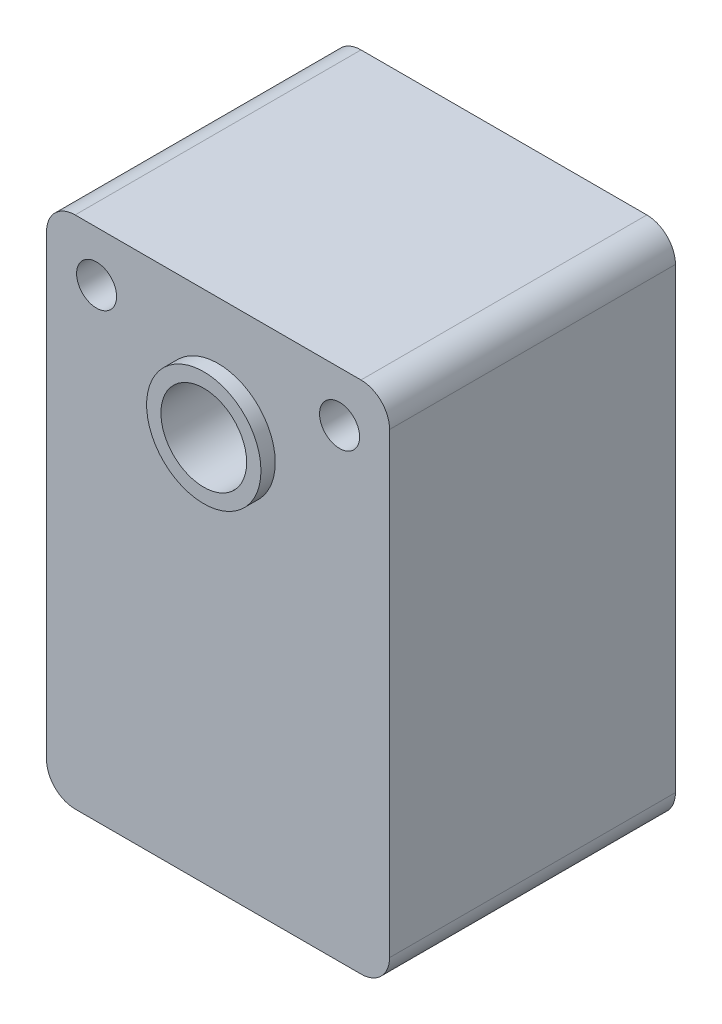
ISO-10303-21;
HEADER;
FILE_DESCRIPTION(('STEP AP214'),'2;1');
FILE_NAME('part.step','',(''),(''),'','','');
FILE_SCHEMA(('AUTOMOTIVE_DESIGN { 1 0 10303 214 1 1 1 1 }'));
ENDSEC;
DATA;
#1=APPLICATION_CONTEXT('core data for automotive mechanical design processes');
#2=APPLICATION_PROTOCOL_DEFINITION('international standard','automotive_design',2000,#1);
#3=PRODUCT_CONTEXT('',#1,'mechanical');
#4=PRODUCT('Part','Part','',(#3));
#5=PRODUCT_RELATED_PRODUCT_CATEGORY('part','',(#4));
#6=PRODUCT_DEFINITION_FORMATION('','',#4);
#7=PRODUCT_DEFINITION_CONTEXT('part definition',#1,'design');
#8=PRODUCT_DEFINITION('design','',#6,#7);
#9=PRODUCT_DEFINITION_SHAPE('','',#8);
#10=(LENGTH_UNIT() NAMED_UNIT(*) SI_UNIT(.MILLI.,.METRE.));
#11=(NAMED_UNIT(*) PLANE_ANGLE_UNIT() SI_UNIT($,.RADIAN.));
#12=(NAMED_UNIT(*) SI_UNIT($,.STERADIAN.) SOLID_ANGLE_UNIT());
#13=UNCERTAINTY_MEASURE_WITH_UNIT(LENGTH_MEASURE(1.E-05),#10,'distance_accuracy_value','');
#14=(GEOMETRIC_REPRESENTATION_CONTEXT(3) GLOBAL_UNCERTAINTY_ASSIGNED_CONTEXT((#13)) GLOBAL_UNIT_ASSIGNED_CONTEXT((#10,
#11,#12)) REPRESENTATION_CONTEXT('',''));
#15=CARTESIAN_POINT('',(0.,0.,0.));
#16=DIRECTION('',(0.,0.,1.));
#17=DIRECTION('',(1.,0.,0.));
#18=AXIS2_PLACEMENT_3D('',#15,#16,#17);
#19=CARTESIAN_POINT('',(0.,0.,10.));
#20=DIRECTION('',(0.,0.,1.));
#21=DIRECTION('',(1.,0.,0.));
#22=AXIS2_PLACEMENT_3D('',#19,#20,#21);
#23=PLANE('',#22);
#24=CARTESIAN_POINT('',(4.25,7.25,10.));
#25=DIRECTION('',(0.,0.,1.));
#26=DIRECTION('',(-1.,0.,0.));
#27=AXIS2_PLACEMENT_3D('',#24,#25,#26);
#28=CIRCLE('',#27,0.7);
#29=CARTESIAN_POINT('',(3.55,7.25,10.));
#30=VERTEX_POINT('',#29);
#31=EDGE_CURVE('E203',#30,#30,#28,.T.);
#32=ORIENTED_EDGE('',*,*,#31,.F.);
#33=EDGE_LOOP('',(#32));
#34=FACE_BOUND('',#33,.T.);
#35=DIRECTION('',(0.,-1.,0.));
#36=VECTOR('',#35,1.);
#37=CARTESIAN_POINT('',(-6.,-9.,10.));
#38=LINE('',#37,#36);
#39=CARTESIAN_POINT('',(-6.,8.,10.));
#40=VERTEX_POINT('',#39);
#41=CARTESIAN_POINT('',(-6.,-8.,10.));
#42=VERTEX_POINT('',#41);
#43=EDGE_CURVE('E150',#40,#42,#38,.T.);
#44=ORIENTED_EDGE('',*,*,#43,.T.);
#45=CARTESIAN_POINT('',(-5.,-8.,10.));
#46=DIRECTION('',(0.,0.,1.));
#47=DIRECTION('',(1.,0.,0.));
#48=AXIS2_PLACEMENT_3D('',#45,#46,#47);
#49=CIRCLE('',#48,1.);
#50=CARTESIAN_POINT('',(-5.,-9.,10.));
#51=VERTEX_POINT('',#50);
#52=EDGE_CURVE('E174',#42,#51,#49,.T.);
#53=ORIENTED_EDGE('',*,*,#52,.T.);
#54=DIRECTION('',(1.,0.,0.));
#55=VECTOR('',#54,1.);
#56=CARTESIAN_POINT('',(6.,-9.,10.));
#57=LINE('',#56,#55);
#58=CARTESIAN_POINT('',(5.,-9.,10.));
#59=VERTEX_POINT('',#58);
#60=EDGE_CURVE('E127',#51,#59,#57,.T.);
#61=ORIENTED_EDGE('',*,*,#60,.T.);
#62=CARTESIAN_POINT('',(5.,-8.,10.));
#63=DIRECTION('',(0.,0.,1.));
#64=DIRECTION('',(1.,0.,0.));
#65=AXIS2_PLACEMENT_3D('',#62,#63,#64);
#66=CIRCLE('',#65,1.);
#67=CARTESIAN_POINT('',(6.,-8.,10.));
#68=VERTEX_POINT('',#67);
#69=EDGE_CURVE('E171',#59,#68,#66,.T.);
#70=ORIENTED_EDGE('',*,*,#69,.T.);
#71=DIRECTION('',(0.,1.,0.));
#72=VECTOR('',#71,1.);
#73=CARTESIAN_POINT('',(6.,-9.,10.));
#74=LINE('',#73,#72);
#75=CARTESIAN_POINT('',(6.,8.,10.));
#76=VERTEX_POINT('',#75);
#77=EDGE_CURVE('E186',#68,#76,#74,.T.);
#78=ORIENTED_EDGE('',*,*,#77,.T.);
#79=CARTESIAN_POINT('',(5.,8.,10.));
#80=DIRECTION('',(0.,0.,1.));
#81=DIRECTION('',(1.,0.,0.));
#82=AXIS2_PLACEMENT_3D('',#79,#80,#81);
#83=CIRCLE('',#82,1.);
#84=CARTESIAN_POINT('',(5.,9.00000000000001,10.));
#85=VERTEX_POINT('',#84);
#86=EDGE_CURVE('E61',#76,#85,#83,.T.);
#87=ORIENTED_EDGE('',*,*,#86,.T.);
#88=DIRECTION('',(-1.,0.,0.));
#89=VECTOR('',#88,1.);
#90=CARTESIAN_POINT('',(6.,9.00000000000001,10.));
#91=LINE('',#90,#89);
#92=CARTESIAN_POINT('',(-5.,9.00000000000001,10.));
#93=VERTEX_POINT('',#92);
#94=EDGE_CURVE('E152',#85,#93,#91,.T.);
#95=ORIENTED_EDGE('',*,*,#94,.T.);
#96=CARTESIAN_POINT('',(-5.,8.,10.));
#97=DIRECTION('',(0.,0.,1.));
#98=DIRECTION('',(1.,0.,0.));
#99=AXIS2_PLACEMENT_3D('',#96,#97,#98);
#100=CIRCLE('',#99,1.);
#101=EDGE_CURVE('E166',#93,#40,#100,.T.);
#102=ORIENTED_EDGE('',*,*,#101,.T.);
#103=EDGE_LOOP('',(#44,#53,#61,#70,#78,#87,#95,#102));
#104=FACE_BOUND('',#103,.T.);
#105=CARTESIAN_POINT('',(-4.25,7.25,10.));
#106=DIRECTION('',(0.,0.,1.));
#107=DIRECTION('',(1.,0.,0.));
#108=AXIS2_PLACEMENT_3D('',#105,#106,#107);
#109=CIRCLE('',#108,0.7);
#110=CARTESIAN_POINT('',(-3.55,7.25,10.));
#111=VERTEX_POINT('',#110);
#112=EDGE_CURVE('E198',#111,#111,#109,.T.);
#113=ORIENTED_EDGE('',*,*,#112,.F.);
#114=EDGE_LOOP('',(#113));
#115=FACE_BOUND('',#114,.T.);
#116=CARTESIAN_POINT('',(0.,4.99999999999999,10.));
#117=DIRECTION('',(0.,0.,1.));
#118=DIRECTION('',(1.,0.,0.));
#119=AXIS2_PLACEMENT_3D('',#116,#117,#118);
#120=CIRCLE('',#119,2.);
#121=CARTESIAN_POINT('',(2.,4.99999999999999,10.));
#122=VERTEX_POINT('',#121);
#123=EDGE_CURVE('E215',#122,#122,#120,.T.);
#124=ORIENTED_EDGE('',*,*,#123,.F.);
#125=EDGE_LOOP('',(#124));
#126=FACE_BOUND('',#125,.T.);
#127=ADVANCED_FACE('F39',(#34,#104,#115,#126),#23,.T.);
#128=CARTESIAN_POINT('',(0.,0.,0.));
#129=DIRECTION('',(0.,0.,1.));
#130=DIRECTION('',(1.,0.,0.));
#131=AXIS2_PLACEMENT_3D('',#128,#129,#130);
#132=PLANE('',#131);
#133=DIRECTION('',(1.,0.,0.));
#134=VECTOR('',#133,1.);
#135=CARTESIAN_POINT('',(6.,-9.,0.));
#136=LINE('',#135,#134);
#137=CARTESIAN_POINT('',(-5.,-9.,0.));
#138=VERTEX_POINT('',#137);
#139=CARTESIAN_POINT('',(5.,-9.,0.));
#140=VERTEX_POINT('',#139);
#141=EDGE_CURVE('E124',#138,#140,#136,.T.);
#142=ORIENTED_EDGE('',*,*,#141,.F.);
#143=CARTESIAN_POINT('',(-5.,-8.,0.));
#144=DIRECTION('',(0.,0.,1.));
#145=DIRECTION('',(1.,0.,0.));
#146=AXIS2_PLACEMENT_3D('',#143,#144,#145);
#147=CIRCLE('',#146,1.);
#148=CARTESIAN_POINT('',(-6.,-8.,0.));
#149=VERTEX_POINT('',#148);
#150=EDGE_CURVE('E106',#138,#149,#147,.F.);
#151=ORIENTED_EDGE('',*,*,#150,.T.);
#152=DIRECTION('',(0.,-1.,0.));
#153=VECTOR('',#152,1.);
#154=CARTESIAN_POINT('',(-6.,-9.,0.));
#155=LINE('',#154,#153);
#156=CARTESIAN_POINT('',(-6.,8.,0.));
#157=VERTEX_POINT('',#156);
#158=EDGE_CURVE('E137',#157,#149,#155,.T.);
#159=ORIENTED_EDGE('',*,*,#158,.F.);
#160=CARTESIAN_POINT('',(-5.,8.,0.));
#161=DIRECTION('',(0.,0.,1.));
#162=DIRECTION('',(1.,0.,0.));
#163=AXIS2_PLACEMENT_3D('',#160,#161,#162);
#164=CIRCLE('',#163,1.);
#165=CARTESIAN_POINT('',(-5.,9.00000000000001,0.));
#166=VERTEX_POINT('',#165);
#167=EDGE_CURVE('E129',#157,#166,#164,.F.);
#168=ORIENTED_EDGE('',*,*,#167,.T.);
#169=DIRECTION('',(-1.,0.,0.));
#170=VECTOR('',#169,1.);
#171=CARTESIAN_POINT('',(6.,9.00000000000001,0.));
#172=LINE('',#171,#170);
#173=CARTESIAN_POINT('',(5.,9.00000000000001,0.));
#174=VERTEX_POINT('',#173);
#175=EDGE_CURVE('E142',#174,#166,#172,.T.);
#176=ORIENTED_EDGE('',*,*,#175,.F.);
#177=CARTESIAN_POINT('',(5.,8.,0.));
#178=DIRECTION('',(0.,0.,1.));
#179=DIRECTION('',(1.,0.,0.));
#180=AXIS2_PLACEMENT_3D('',#177,#178,#179);
#181=CIRCLE('',#180,1.);
#182=CARTESIAN_POINT('',(6.,8.,0.));
#183=VERTEX_POINT('',#182);
#184=EDGE_CURVE('E156',#174,#183,#181,.F.);
#185=ORIENTED_EDGE('',*,*,#184,.T.);
#186=DIRECTION('',(0.,1.,0.));
#187=VECTOR('',#186,1.);
#188=CARTESIAN_POINT('',(6.,-9.,0.));
#189=LINE('',#188,#187);
#190=CARTESIAN_POINT('',(6.,-8.,0.));
#191=VERTEX_POINT('',#190);
#192=EDGE_CURVE('E136',#191,#183,#189,.T.);
#193=ORIENTED_EDGE('',*,*,#192,.F.);
#194=CARTESIAN_POINT('',(5.,-8.,0.));
#195=DIRECTION('',(0.,0.,1.));
#196=DIRECTION('',(1.,0.,0.));
#197=AXIS2_PLACEMENT_3D('',#194,#195,#196);
#198=CIRCLE('',#197,1.);
#199=EDGE_CURVE('E118',#191,#140,#198,.F.);
#200=ORIENTED_EDGE('',*,*,#199,.T.);
#201=EDGE_LOOP('',(#142,#151,#159,#168,#176,#185,#193,#200));
#202=FACE_BOUND('',#201,.T.);
#203=CARTESIAN_POINT('',(0.,4.99999999999999,0.));
#204=DIRECTION('',(0.,0.,1.));
#205=DIRECTION('',(1.,0.,0.));
#206=AXIS2_PLACEMENT_3D('',#203,#204,#205);
#207=CIRCLE('',#206,1.5);
#208=CARTESIAN_POINT('',(1.5,4.99999999999999,0.));
#209=VERTEX_POINT('',#208);
#210=EDGE_CURVE('E144',#209,#209,#207,.T.);
#211=ORIENTED_EDGE('',*,*,#210,.T.);
#212=EDGE_LOOP('',(#211));
#213=FACE_BOUND('',#212,.T.);
#214=CARTESIAN_POINT('',(-4.25,7.25,0.));
#215=DIRECTION('',(0.,0.,1.));
#216=DIRECTION('',(1.,0.,0.));
#217=AXIS2_PLACEMENT_3D('',#214,#215,#216);
#218=CIRCLE('',#217,0.7);
#219=CARTESIAN_POINT('',(-3.55,7.25,0.));
#220=VERTEX_POINT('',#219);
#221=EDGE_CURVE('E199',#220,#220,#218,.T.);
#222=ORIENTED_EDGE('',*,*,#221,.T.);
#223=EDGE_LOOP('',(#222));
#224=FACE_BOUND('',#223,.T.);
#225=CARTESIAN_POINT('',(4.25,7.25,0.));
#226=DIRECTION('',(0.,0.,1.));
#227=DIRECTION('',(-1.,0.,0.));
#228=AXIS2_PLACEMENT_3D('',#225,#226,#227);
#229=CIRCLE('',#228,0.7);
#230=CARTESIAN_POINT('',(3.55,7.25,0.));
#231=VERTEX_POINT('',#230);
#232=EDGE_CURVE('E207',#231,#231,#229,.T.);
#233=ORIENTED_EDGE('',*,*,#232,.T.);
#234=EDGE_LOOP('',(#233));
#235=FACE_BOUND('',#234,.T.);
#236=ADVANCED_FACE('F132',(#202,#213,#224,#235),#132,.F.);
#237=CARTESIAN_POINT('',(-6.,-9.,10.));
#238=DIRECTION('',(1.,0.,0.));
#239=DIRECTION('',(0.,0.,-1.));
#240=AXIS2_PLACEMENT_3D('',#237,#238,#239);
#241=PLANE('',#240);
#242=ORIENTED_EDGE('',*,*,#158,.T.);
#243=DIRECTION('',(0.,0.,-1.));
#244=VECTOR('',#243,1.);
#245=CARTESIAN_POINT('',(-6.,-8.,10.));
#246=LINE('',#245,#244);
#247=EDGE_CURVE('E111',#149,#42,#246,.F.);
#248=ORIENTED_EDGE('',*,*,#247,.T.);
#249=ORIENTED_EDGE('',*,*,#43,.F.);
#250=DIRECTION('',(0.,0.,-1.));
#251=VECTOR('',#250,1.);
#252=CARTESIAN_POINT('',(-6.,8.,10.));
#253=LINE('',#252,#251);
#254=EDGE_CURVE('E117',#40,#157,#253,.T.);
#255=ORIENTED_EDGE('',*,*,#254,.T.);
#256=EDGE_LOOP('',(#242,#248,#249,#255));
#257=FACE_BOUND('',#256,.T.);
#258=ADVANCED_FACE('F250',(#257),#241,.F.);
#259=CARTESIAN_POINT('',(6.,-9.,10.));
#260=DIRECTION('',(0.,1.,0.));
#261=DIRECTION('',(0.,0.,1.));
#262=AXIS2_PLACEMENT_3D('',#259,#260,#261);
#263=PLANE('',#262);
#264=ORIENTED_EDGE('',*,*,#60,.F.);
#265=DIRECTION('',(0.,0.,-1.));
#266=VECTOR('',#265,1.);
#267=CARTESIAN_POINT('',(-5.,-9.,10.));
#268=LINE('',#267,#266);
#269=EDGE_CURVE('E110',#51,#138,#268,.T.);
#270=ORIENTED_EDGE('',*,*,#269,.T.);
#271=ORIENTED_EDGE('',*,*,#141,.T.);
#272=DIRECTION('',(0.,0.,-1.));
#273=VECTOR('',#272,1.);
#274=CARTESIAN_POINT('',(5.,-9.,10.));
#275=LINE('',#274,#273);
#276=EDGE_CURVE('E130',#140,#59,#275,.F.);
#277=ORIENTED_EDGE('',*,*,#276,.T.);
#278=EDGE_LOOP('',(#264,#270,#271,#277));
#279=FACE_BOUND('',#278,.T.);
#280=ADVANCED_FACE('F123',(#279),#263,.F.);
#281=CARTESIAN_POINT('',(6.,-9.,10.));
#282=DIRECTION('',(-1.,0.,0.));
#283=DIRECTION('',(0.,0.,1.));
#284=AXIS2_PLACEMENT_3D('',#281,#282,#283);
#285=PLANE('',#284);
#286=ORIENTED_EDGE('',*,*,#77,.F.);
#287=DIRECTION('',(0.,0.,-1.));
#288=VECTOR('',#287,1.);
#289=CARTESIAN_POINT('',(6.,-8.,10.));
#290=LINE('',#289,#288);
#291=EDGE_CURVE('E180',#68,#191,#290,.T.);
#292=ORIENTED_EDGE('',*,*,#291,.T.);
#293=ORIENTED_EDGE('',*,*,#192,.T.);
#294=DIRECTION('',(0.,0.,-1.));
#295=VECTOR('',#294,1.);
#296=CARTESIAN_POINT('',(6.,8.,10.));
#297=LINE('',#296,#295);
#298=EDGE_CURVE('E177',#183,#76,#297,.F.);
#299=ORIENTED_EDGE('',*,*,#298,.T.);
#300=EDGE_LOOP('',(#286,#292,#293,#299));
#301=FACE_BOUND('',#300,.T.);
#302=ADVANCED_FACE('F259',(#301),#285,.F.);
#303=CARTESIAN_POINT('',(6.,9.00000000000001,10.));
#304=DIRECTION('',(0.,-1.,0.));
#305=DIRECTION('',(0.,0.,-1.));
#306=AXIS2_PLACEMENT_3D('',#303,#304,#305);
#307=PLANE('',#306);
#308=ORIENTED_EDGE('',*,*,#94,.F.);
#309=DIRECTION('',(0.,0.,-1.));
#310=VECTOR('',#309,1.);
#311=CARTESIAN_POINT('',(5.,9.00000000000001,10.));
#312=LINE('',#311,#310);
#313=EDGE_CURVE('E11',#85,#174,#312,.T.);
#314=ORIENTED_EDGE('',*,*,#313,.T.);
#315=ORIENTED_EDGE('',*,*,#175,.T.);
#316=DIRECTION('',(0.,0.,-1.));
#317=VECTOR('',#316,1.);
#318=CARTESIAN_POINT('',(-5.,9.00000000000001,10.));
#319=LINE('',#318,#317);
#320=EDGE_CURVE('E48',#166,#93,#319,.F.);
#321=ORIENTED_EDGE('',*,*,#320,.T.);
#322=EDGE_LOOP('',(#308,#314,#315,#321));
#323=FACE_BOUND('',#322,.T.);
#324=ADVANCED_FACE('F256',(#323),#307,.F.);
#325=CARTESIAN_POINT('',(0.,4.99999999999999,10.));
#326=DIRECTION('',(0.,0.,-1.));
#327=DIRECTION('',(-1.,0.,0.));
#328=AXIS2_PLACEMENT_3D('',#325,#326,#327);
#329=CYLINDRICAL_SURFACE('',#328,1.5);
#330=ORIENTED_EDGE('',*,*,#210,.F.);
#331=EDGE_LOOP('',(#330));
#332=FACE_BOUND('',#331,.T.);
#333=CARTESIAN_POINT('',(0.,4.99999999999999,10.5));
#334=DIRECTION('',(0.,0.,1.));
#335=DIRECTION('',(1.,0.,0.));
#336=AXIS2_PLACEMENT_3D('',#333,#334,#335);
#337=CIRCLE('',#336,1.5);
#338=CARTESIAN_POINT('',(1.5,4.99999999999999,10.5));
#339=VERTEX_POINT('',#338);
#340=EDGE_CURVE('E219',#339,#339,#337,.T.);
#341=ORIENTED_EDGE('',*,*,#340,.T.);
#342=EDGE_LOOP('',(#341));
#343=FACE_BOUND('',#342,.T.);
#344=ADVANCED_FACE('F227',(#332,#343),#329,.F.);
#345=CARTESIAN_POINT('',(-4.25,7.25,10.));
#346=DIRECTION('',(0.,0.,-1.));
#347=DIRECTION('',(-1.,0.,0.));
#348=AXIS2_PLACEMENT_3D('',#345,#346,#347);
#349=CYLINDRICAL_SURFACE('',#348,0.7);
#350=ORIENTED_EDGE('',*,*,#112,.T.);
#351=EDGE_LOOP('',(#350));
#352=FACE_BOUND('',#351,.T.);
#353=ORIENTED_EDGE('',*,*,#221,.F.);
#354=EDGE_LOOP('',(#353));
#355=FACE_BOUND('',#354,.T.);
#356=ADVANCED_FACE('F241',(#352,#355),#349,.F.);
#357=CARTESIAN_POINT('',(4.25,7.25,10.));
#358=DIRECTION('',(0.,0.,-1.));
#359=DIRECTION('',(-1.,0.,0.));
#360=AXIS2_PLACEMENT_3D('',#357,#358,#359);
#361=CYLINDRICAL_SURFACE('',#360,0.7);
#362=ORIENTED_EDGE('',*,*,#31,.T.);
#363=EDGE_LOOP('',(#362));
#364=FACE_BOUND('',#363,.T.);
#365=ORIENTED_EDGE('',*,*,#232,.F.);
#366=EDGE_LOOP('',(#365));
#367=FACE_BOUND('',#366,.T.);
#368=ADVANCED_FACE('F232',(#364,#367),#361,.F.);
#369=CARTESIAN_POINT('',(0.,4.99999999999999,10.5));
#370=DIRECTION('',(0.,0.,1.));
#371=DIRECTION('',(1.,0.,0.));
#372=AXIS2_PLACEMENT_3D('',#369,#370,#371);
#373=PLANE('',#372);
#374=CARTESIAN_POINT('',(0.,4.99999999999999,10.5));
#375=DIRECTION('',(0.,0.,1.));
#376=DIRECTION('',(1.,0.,0.));
#377=AXIS2_PLACEMENT_3D('',#374,#375,#376);
#378=CIRCLE('',#377,2.);
#379=CARTESIAN_POINT('',(2.,4.99999999999999,10.5));
#380=VERTEX_POINT('',#379);
#381=EDGE_CURVE('E211',#380,#380,#378,.T.);
#382=ORIENTED_EDGE('',*,*,#381,.T.);
#383=EDGE_LOOP('',(#382));
#384=FACE_BOUND('',#383,.T.);
#385=ORIENTED_EDGE('',*,*,#340,.F.);
#386=EDGE_LOOP('',(#385));
#387=FACE_BOUND('',#386,.T.);
#388=ADVANCED_FACE('F229',(#384,#387),#373,.T.);
#389=CARTESIAN_POINT('',(0.,4.99999999999999,10.5));
#390=DIRECTION('',(0.,0.,-1.));
#391=DIRECTION('',(-1.,0.,0.));
#392=AXIS2_PLACEMENT_3D('',#389,#390,#391);
#393=CYLINDRICAL_SURFACE('',#392,2.);
#394=ORIENTED_EDGE('',*,*,#381,.F.);
#395=EDGE_LOOP('',(#394));
#396=FACE_BOUND('',#395,.T.);
#397=ORIENTED_EDGE('',*,*,#123,.T.);
#398=EDGE_LOOP('',(#397));
#399=FACE_BOUND('',#398,.T.);
#400=ADVANCED_FACE('F231',(#396,#399),#393,.T.);
#401=CARTESIAN_POINT('',(-5.,-8.,10.));
#402=DIRECTION('',(0.,0.,-1.));
#403=DIRECTION('',(-1.,0.,0.));
#404=AXIS2_PLACEMENT_3D('',#401,#402,#403);
#405=CYLINDRICAL_SURFACE('',#404,1.);
#406=ORIENTED_EDGE('',*,*,#52,.F.);
#407=ORIENTED_EDGE('',*,*,#247,.F.);
#408=ORIENTED_EDGE('',*,*,#150,.F.);
#409=ORIENTED_EDGE('',*,*,#269,.F.);
#410=EDGE_LOOP('',(#406,#407,#408,#409));
#411=FACE_BOUND('',#410,.T.);
#412=ADVANCED_FACE('F109',(#411),#405,.T.);
#413=CARTESIAN_POINT('',(5.,-8.,10.));
#414=DIRECTION('',(0.,0.,-1.));
#415=DIRECTION('',(-1.,0.,0.));
#416=AXIS2_PLACEMENT_3D('',#413,#414,#415);
#417=CYLINDRICAL_SURFACE('',#416,1.);
#418=ORIENTED_EDGE('',*,*,#69,.F.);
#419=ORIENTED_EDGE('',*,*,#276,.F.);
#420=ORIENTED_EDGE('',*,*,#199,.F.);
#421=ORIENTED_EDGE('',*,*,#291,.F.);
#422=EDGE_LOOP('',(#418,#419,#420,#421));
#423=FACE_BOUND('',#422,.T.);
#424=ADVANCED_FACE('F270',(#423),#417,.T.);
#425=CARTESIAN_POINT('',(5.,8.,10.));
#426=DIRECTION('',(0.,0.,-1.));
#427=DIRECTION('',(-1.,0.,0.));
#428=AXIS2_PLACEMENT_3D('',#425,#426,#427);
#429=CYLINDRICAL_SURFACE('',#428,1.);
#430=ORIENTED_EDGE('',*,*,#86,.F.);
#431=ORIENTED_EDGE('',*,*,#298,.F.);
#432=ORIENTED_EDGE('',*,*,#184,.F.);
#433=ORIENTED_EDGE('',*,*,#313,.F.);
#434=EDGE_LOOP('',(#430,#431,#432,#433));
#435=FACE_BOUND('',#434,.T.);
#436=ADVANCED_FACE('F272',(#435),#429,.T.);
#437=CARTESIAN_POINT('',(-5.,8.,10.));
#438=DIRECTION('',(0.,0.,-1.));
#439=DIRECTION('',(-1.,0.,0.));
#440=AXIS2_PLACEMENT_3D('',#437,#438,#439);
#441=CYLINDRICAL_SURFACE('',#440,1.);
#442=ORIENTED_EDGE('',*,*,#101,.F.);
#443=ORIENTED_EDGE('',*,*,#320,.F.);
#444=ORIENTED_EDGE('',*,*,#167,.F.);
#445=ORIENTED_EDGE('',*,*,#254,.F.);
#446=EDGE_LOOP('',(#442,#443,#444,#445));
#447=FACE_BOUND('',#446,.T.);
#448=ADVANCED_FACE('F41',(#447),#441,.T.);
#449=CLOSED_SHELL('',(#127,#236,#258,#280,#302,#324,#344,#356,#368,#388,#400,#412,#424,#436,#448));
#450=MANIFOLD_SOLID_BREP('B2',#449);
#451=ADVANCED_BREP_SHAPE_REPRESENTATION('',(#18,#450),#14);
#452=SHAPE_DEFINITION_REPRESENTATION(#9,#451);
ENDSEC;
END-ISO-10303-21;
